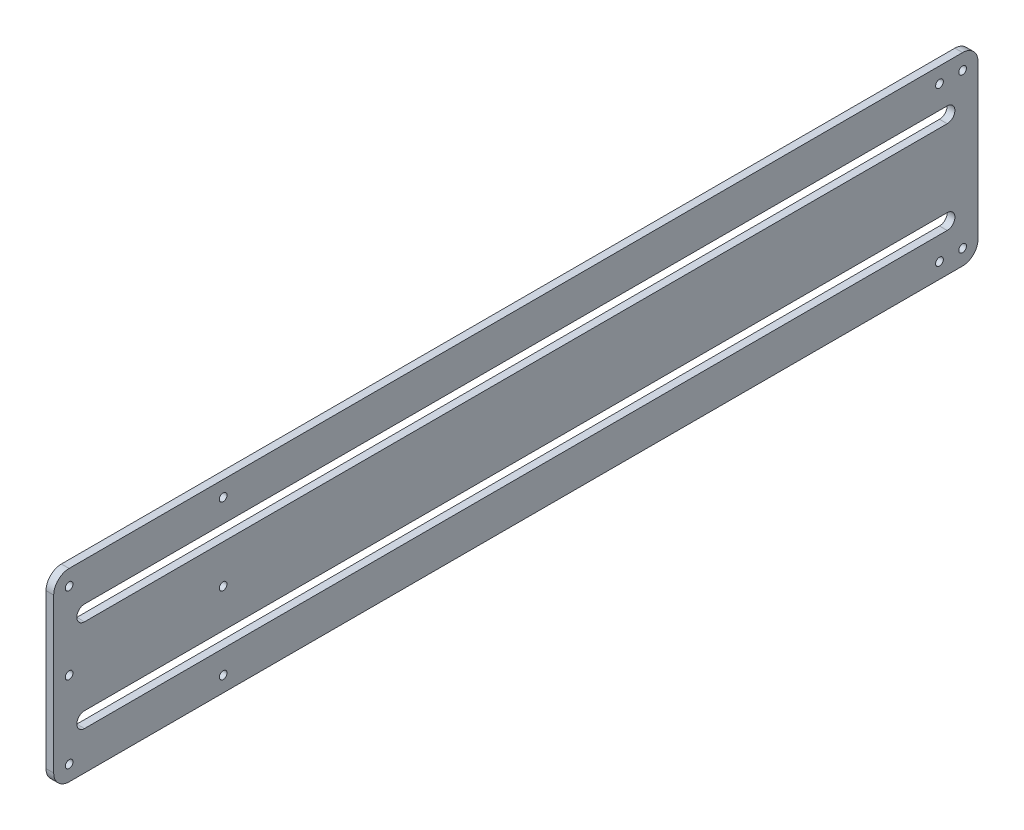
ISO-10303-21;
HEADER;
FILE_DESCRIPTION(('STEP AP214'),'2;1');
FILE_NAME('part.step','',(''),(''),'','','');
FILE_SCHEMA(('AUTOMOTIVE_DESIGN { 1 0 10303 214 1 1 1 1 }'));
ENDSEC;
DATA;
#1=APPLICATION_CONTEXT('core data for automotive mechanical design processes');
#2=APPLICATION_PROTOCOL_DEFINITION('international standard','automotive_design',2000,#1);
#3=PRODUCT_CONTEXT('',#1,'mechanical');
#4=PRODUCT('Part','Part','',(#3));
#5=PRODUCT_RELATED_PRODUCT_CATEGORY('part','',(#4));
#6=PRODUCT_DEFINITION_FORMATION('','',#4);
#7=PRODUCT_DEFINITION_CONTEXT('part definition',#1,'design');
#8=PRODUCT_DEFINITION('design','',#6,#7);
#9=PRODUCT_DEFINITION_SHAPE('','',#8);
#10=(LENGTH_UNIT() NAMED_UNIT(*) SI_UNIT(.MILLI.,.METRE.));
#11=(NAMED_UNIT(*) PLANE_ANGLE_UNIT() SI_UNIT($,.RADIAN.));
#12=(NAMED_UNIT(*) SI_UNIT($,.STERADIAN.) SOLID_ANGLE_UNIT());
#13=UNCERTAINTY_MEASURE_WITH_UNIT(LENGTH_MEASURE(1.E-05),#10,'distance_accuracy_value','');
#14=(GEOMETRIC_REPRESENTATION_CONTEXT(3) GLOBAL_UNCERTAINTY_ASSIGNED_CONTEXT((#13)) GLOBAL_UNIT_ASSIGNED_CONTEXT((#10,
#11,#12)) REPRESENTATION_CONTEXT('',''));
#15=CARTESIAN_POINT('',(0.,0.,0.));
#16=DIRECTION('',(0.,0.,1.));
#17=DIRECTION('',(1.,0.,0.));
#18=AXIS2_PLACEMENT_3D('',#15,#16,#17);
#19=CARTESIAN_POINT('',(1.5875,-31.75,184.15));
#20=DIRECTION('',(-1.,0.,0.));
#21=DIRECTION('',(0.,0.,1.));
#22=AXIS2_PLACEMENT_3D('',#19,#20,#21);
#23=CYLINDRICAL_SURFACE('',#22,6.35);
#24=CARTESIAN_POINT('',(-1.5875,-31.75,184.15));
#25=DIRECTION('',(1.,0.,0.));
#26=DIRECTION('',(0.,0.,-1.));
#27=AXIS2_PLACEMENT_3D('',#24,#25,#26);
#28=CIRCLE('',#27,6.35);
#29=CARTESIAN_POINT('',(-1.5875,-31.75,190.5));
#30=VERTEX_POINT('',#29);
#31=CARTESIAN_POINT('',(-1.5875,-38.1,184.15));
#32=VERTEX_POINT('',#31);
#33=EDGE_CURVE('E207',#30,#32,#28,.T.);
#34=ORIENTED_EDGE('',*,*,#33,.T.);
#35=DIRECTION('',(-1.,0.,0.));
#36=VECTOR('',#35,1.);
#37=CARTESIAN_POINT('',(1.5875,-38.1,184.15));
#38=LINE('',#37,#36);
#39=CARTESIAN_POINT('',(1.5875,-38.1,184.15));
#40=VERTEX_POINT('',#39);
#41=EDGE_CURVE('E11',#40,#32,#38,.T.);
#42=ORIENTED_EDGE('',*,*,#41,.F.);
#43=CARTESIAN_POINT('',(1.5875,-31.75,184.15));
#44=DIRECTION('',(1.,0.,0.));
#45=DIRECTION('',(0.,0.,-1.));
#46=AXIS2_PLACEMENT_3D('',#43,#44,#45);
#47=CIRCLE('',#46,6.35);
#48=CARTESIAN_POINT('',(1.5875,-31.75,190.5));
#49=VERTEX_POINT('',#48);
#50=EDGE_CURVE('E256',#49,#40,#47,.T.);
#51=ORIENTED_EDGE('',*,*,#50,.F.);
#52=DIRECTION('',(-1.,0.,0.));
#53=VECTOR('',#52,1.);
#54=CARTESIAN_POINT('',(1.5875,-31.75,190.5));
#55=LINE('',#54,#53);
#56=EDGE_CURVE('E282',#49,#30,#55,.T.);
#57=ORIENTED_EDGE('',*,*,#56,.T.);
#58=EDGE_LOOP('',(#34,#42,#51,#57));
#59=FACE_BOUND('',#58,.T.);
#60=ADVANCED_FACE('F45',(#59),#23,.T.);
#61=CARTESIAN_POINT('',(1.5875,-38.1,184.15));
#62=DIRECTION('',(0.,1.,0.));
#63=DIRECTION('',(0.,0.,1.));
#64=AXIS2_PLACEMENT_3D('',#61,#62,#63);
#65=PLANE('',#64);
#66=DIRECTION('',(0.,0.,-1.));
#67=VECTOR('',#66,1.);
#68=CARTESIAN_POINT('',(-1.5875,-38.1,184.15));
#69=LINE('',#68,#67);
#70=CARTESIAN_POINT('',(-1.5875,-38.1,-184.15));
#71=VERTEX_POINT('',#70);
#72=EDGE_CURVE('E286',#32,#71,#69,.T.);
#73=ORIENTED_EDGE('',*,*,#72,.T.);
#74=DIRECTION('',(-1.,0.,0.));
#75=VECTOR('',#74,1.);
#76=CARTESIAN_POINT('',(1.5875,-38.1,-184.15));
#77=LINE('',#76,#75);
#78=CARTESIAN_POINT('',(1.5875,-38.1,-184.15));
#79=VERTEX_POINT('',#78);
#80=EDGE_CURVE('E53',#79,#71,#77,.T.);
#81=ORIENTED_EDGE('',*,*,#80,.F.);
#82=DIRECTION('',(0.,0.,-1.));
#83=VECTOR('',#82,1.);
#84=CARTESIAN_POINT('',(1.5875,-38.1,184.15));
#85=LINE('',#84,#83);
#86=EDGE_CURVE('E260',#40,#79,#85,.T.);
#87=ORIENTED_EDGE('',*,*,#86,.F.);
#88=ORIENTED_EDGE('',*,*,#41,.T.);
#89=EDGE_LOOP('',(#73,#81,#87,#88));
#90=FACE_BOUND('',#89,.T.);
#91=ADVANCED_FACE('F356',(#90),#65,.F.);
#92=CARTESIAN_POINT('',(1.5875,-31.75,-184.15));
#93=DIRECTION('',(-1.,0.,0.));
#94=DIRECTION('',(0.,0.,1.));
#95=AXIS2_PLACEMENT_3D('',#92,#93,#94);
#96=CYLINDRICAL_SURFACE('',#95,6.35);
#97=CARTESIAN_POINT('',(-1.5875,-31.75,-184.15));
#98=DIRECTION('',(1.,0.,0.));
#99=DIRECTION('',(0.,0.,-1.));
#100=AXIS2_PLACEMENT_3D('',#97,#98,#99);
#101=CIRCLE('',#100,6.35);
#102=CARTESIAN_POINT('',(-1.5875,-31.75,-190.5));
#103=VERTEX_POINT('',#102);
#104=EDGE_CURVE('E289',#71,#103,#101,.T.);
#105=ORIENTED_EDGE('',*,*,#104,.T.);
#106=DIRECTION('',(-1.,0.,0.));
#107=VECTOR('',#106,1.);
#108=CARTESIAN_POINT('',(1.5875,-31.75,-190.5));
#109=LINE('',#108,#107);
#110=CARTESIAN_POINT('',(1.5875,-31.75,-190.5));
#111=VERTEX_POINT('',#110);
#112=EDGE_CURVE('E325',#111,#103,#109,.T.);
#113=ORIENTED_EDGE('',*,*,#112,.F.);
#114=CARTESIAN_POINT('',(1.5875,-31.75,-184.15));
#115=DIRECTION('',(1.,0.,0.));
#116=DIRECTION('',(0.,0.,-1.));
#117=AXIS2_PLACEMENT_3D('',#114,#115,#116);
#118=CIRCLE('',#117,6.35);
#119=EDGE_CURVE('E264',#79,#111,#118,.T.);
#120=ORIENTED_EDGE('',*,*,#119,.F.);
#121=ORIENTED_EDGE('',*,*,#80,.T.);
#122=EDGE_LOOP('',(#105,#113,#120,#121));
#123=FACE_BOUND('',#122,.T.);
#124=ADVANCED_FACE('F334',(#123),#96,.T.);
#125=CARTESIAN_POINT('',(1.5875,-31.75,-190.5));
#126=DIRECTION('',(0.,0.,1.));
#127=DIRECTION('',(1.,0.,0.));
#128=AXIS2_PLACEMENT_3D('',#125,#126,#127);
#129=PLANE('',#128);
#130=DIRECTION('',(0.,1.,0.));
#131=VECTOR('',#130,1.);
#132=CARTESIAN_POINT('',(-1.5875,-31.75,-190.5));
#133=LINE('',#132,#131);
#134=CARTESIAN_POINT('',(-1.5875,31.75,-190.5));
#135=VERTEX_POINT('',#134);
#136=EDGE_CURVE('E292',#103,#135,#133,.T.);
#137=ORIENTED_EDGE('',*,*,#136,.T.);
#138=DIRECTION('',(-1.,0.,0.));
#139=VECTOR('',#138,1.);
#140=CARTESIAN_POINT('',(1.5875,31.75,-190.5));
#141=LINE('',#140,#139);
#142=CARTESIAN_POINT('',(1.5875,31.75,-190.5));
#143=VERTEX_POINT('',#142);
#144=EDGE_CURVE('E321',#143,#135,#141,.T.);
#145=ORIENTED_EDGE('',*,*,#144,.F.);
#146=DIRECTION('',(0.,1.,0.));
#147=VECTOR('',#146,1.);
#148=CARTESIAN_POINT('',(1.5875,-31.75,-190.5));
#149=LINE('',#148,#147);
#150=EDGE_CURVE('E267',#111,#143,#149,.T.);
#151=ORIENTED_EDGE('',*,*,#150,.F.);
#152=ORIENTED_EDGE('',*,*,#112,.T.);
#153=EDGE_LOOP('',(#137,#145,#151,#152));
#154=FACE_BOUND('',#153,.T.);
#155=ADVANCED_FACE('F344',(#154),#129,.F.);
#156=CARTESIAN_POINT('',(1.5875,31.75,-184.15));
#157=DIRECTION('',(-1.,0.,0.));
#158=DIRECTION('',(0.,0.,1.));
#159=AXIS2_PLACEMENT_3D('',#156,#157,#158);
#160=CYLINDRICAL_SURFACE('',#159,6.35);
#161=CARTESIAN_POINT('',(-1.5875,31.75,-184.15));
#162=DIRECTION('',(1.,0.,0.));
#163=DIRECTION('',(0.,0.,-1.));
#164=AXIS2_PLACEMENT_3D('',#161,#162,#163);
#165=CIRCLE('',#164,6.35);
#166=CARTESIAN_POINT('',(-1.5875,38.1,-184.15));
#167=VERTEX_POINT('',#166);
#168=EDGE_CURVE('E295',#135,#167,#165,.T.);
#169=ORIENTED_EDGE('',*,*,#168,.T.);
#170=DIRECTION('',(-1.,0.,0.));
#171=VECTOR('',#170,1.);
#172=CARTESIAN_POINT('',(1.5875,38.1,-184.15));
#173=LINE('',#172,#171);
#174=CARTESIAN_POINT('',(1.5875,38.1,-184.15));
#175=VERTEX_POINT('',#174);
#176=EDGE_CURVE('E317',#175,#167,#173,.T.);
#177=ORIENTED_EDGE('',*,*,#176,.F.);
#178=CARTESIAN_POINT('',(1.5875,31.75,-184.15));
#179=DIRECTION('',(1.,0.,0.));
#180=DIRECTION('',(0.,0.,-1.));
#181=AXIS2_PLACEMENT_3D('',#178,#179,#180);
#182=CIRCLE('',#181,6.35);
#183=EDGE_CURVE('E270',#143,#175,#182,.T.);
#184=ORIENTED_EDGE('',*,*,#183,.F.);
#185=ORIENTED_EDGE('',*,*,#144,.T.);
#186=EDGE_LOOP('',(#169,#177,#184,#185));
#187=FACE_BOUND('',#186,.T.);
#188=ADVANCED_FACE('F348',(#187),#160,.T.);
#189=CARTESIAN_POINT('',(1.5875,38.1,184.15));
#190=DIRECTION('',(0.,-1.,0.));
#191=DIRECTION('',(0.,0.,-1.));
#192=AXIS2_PLACEMENT_3D('',#189,#190,#191);
#193=PLANE('',#192);
#194=DIRECTION('',(0.,0.,1.));
#195=VECTOR('',#194,1.);
#196=CARTESIAN_POINT('',(-1.5875,38.1,184.15));
#197=LINE('',#196,#195);
#198=CARTESIAN_POINT('',(-1.5875,38.1,184.15));
#199=VERTEX_POINT('',#198);
#200=EDGE_CURVE('E298',#167,#199,#197,.T.);
#201=ORIENTED_EDGE('',*,*,#200,.T.);
#202=DIRECTION('',(-1.,0.,0.));
#203=VECTOR('',#202,1.);
#204=CARTESIAN_POINT('',(1.5875,38.1,184.15));
#205=LINE('',#204,#203);
#206=CARTESIAN_POINT('',(1.5875,38.1,184.15));
#207=VERTEX_POINT('',#206);
#208=EDGE_CURVE('E313',#207,#199,#205,.T.);
#209=ORIENTED_EDGE('',*,*,#208,.F.);
#210=DIRECTION('',(0.,0.,1.));
#211=VECTOR('',#210,1.);
#212=CARTESIAN_POINT('',(1.5875,38.1,184.15));
#213=LINE('',#212,#211);
#214=EDGE_CURVE('E273',#175,#207,#213,.T.);
#215=ORIENTED_EDGE('',*,*,#214,.F.);
#216=ORIENTED_EDGE('',*,*,#176,.T.);
#217=EDGE_LOOP('',(#201,#209,#215,#216));
#218=FACE_BOUND('',#217,.T.);
#219=ADVANCED_FACE('F369',(#218),#193,.F.);
#220=CARTESIAN_POINT('',(1.5875,31.75,184.15));
#221=DIRECTION('',(-1.,0.,0.));
#222=DIRECTION('',(0.,0.,1.));
#223=AXIS2_PLACEMENT_3D('',#220,#221,#222);
#224=CYLINDRICAL_SURFACE('',#223,6.35);
#225=CARTESIAN_POINT('',(-1.5875,31.75,184.15));
#226=DIRECTION('',(1.,0.,0.));
#227=DIRECTION('',(0.,0.,-1.));
#228=AXIS2_PLACEMENT_3D('',#225,#226,#227);
#229=CIRCLE('',#228,6.35);
#230=CARTESIAN_POINT('',(-1.5875,31.75,190.5));
#231=VERTEX_POINT('',#230);
#232=EDGE_CURVE('E301',#199,#231,#229,.T.);
#233=ORIENTED_EDGE('',*,*,#232,.T.);
#234=DIRECTION('',(-1.,0.,0.));
#235=VECTOR('',#234,1.);
#236=CARTESIAN_POINT('',(1.5875,31.75,190.5));
#237=LINE('',#236,#235);
#238=CARTESIAN_POINT('',(1.5875,31.75,190.5));
#239=VERTEX_POINT('',#238);
#240=EDGE_CURVE('E309',#239,#231,#237,.T.);
#241=ORIENTED_EDGE('',*,*,#240,.F.);
#242=CARTESIAN_POINT('',(1.5875,31.75,184.15));
#243=DIRECTION('',(1.,0.,0.));
#244=DIRECTION('',(0.,0.,-1.));
#245=AXIS2_PLACEMENT_3D('',#242,#243,#244);
#246=CIRCLE('',#245,6.35);
#247=EDGE_CURVE('E276',#207,#239,#246,.T.);
#248=ORIENTED_EDGE('',*,*,#247,.F.);
#249=ORIENTED_EDGE('',*,*,#208,.T.);
#250=EDGE_LOOP('',(#233,#241,#248,#249));
#251=FACE_BOUND('',#250,.T.);
#252=ADVANCED_FACE('F367',(#251),#224,.T.);
#253=CARTESIAN_POINT('',(1.5875,-31.75,190.5));
#254=DIRECTION('',(0.,0.,-1.));
#255=DIRECTION('',(-1.,0.,0.));
#256=AXIS2_PLACEMENT_3D('',#253,#254,#255);
#257=PLANE('',#256);
#258=DIRECTION('',(0.,-1.,0.));
#259=VECTOR('',#258,1.);
#260=CARTESIAN_POINT('',(-1.5875,-31.75,190.5));
#261=LINE('',#260,#259);
#262=EDGE_CURVE('E261',#231,#30,#261,.T.);
#263=ORIENTED_EDGE('',*,*,#262,.T.);
#264=ORIENTED_EDGE('',*,*,#56,.F.);
#265=DIRECTION('',(0.,-1.,0.));
#266=VECTOR('',#265,1.);
#267=CARTESIAN_POINT('',(1.5875,-31.75,190.5));
#268=LINE('',#267,#266);
#269=EDGE_CURVE('E279',#239,#49,#268,.T.);
#270=ORIENTED_EDGE('',*,*,#269,.F.);
#271=ORIENTED_EDGE('',*,*,#240,.T.);
#272=EDGE_LOOP('',(#263,#264,#270,#271));
#273=FACE_BOUND('',#272,.T.);
#274=ADVANCED_FACE('F362',(#273),#257,.F.);
#275=CARTESIAN_POINT('',(1.5875,-31.75,184.15));
#276=DIRECTION('',(1.,0.,0.));
#277=DIRECTION('',(0.,0.,-1.));
#278=AXIS2_PLACEMENT_3D('',#275,#276,#277);
#279=PLANE('',#278);
#280=CARTESIAN_POINT('',(1.5875,-31.75,-184.15));
#281=DIRECTION('',(1.,0.,0.));
#282=DIRECTION('',(0.,0.,1.));
#283=AXIS2_PLACEMENT_3D('',#280,#281,#282);
#284=CIRCLE('',#283,1.58749999999999);
#285=CARTESIAN_POINT('',(1.5875,-31.75,-182.5625));
#286=VERTEX_POINT('',#285);
#287=EDGE_CURVE('E618',#286,#286,#284,.T.);
#288=ORIENTED_EDGE('',*,*,#287,.F.);
#289=EDGE_LOOP('',(#288));
#290=FACE_BOUND('',#289,.T.);
#291=CARTESIAN_POINT('',(1.5875,-31.7499999999999,-174.625));
#292=DIRECTION('',(1.,0.,0.));
#293=DIRECTION('',(0.,0.,1.));
#294=AXIS2_PLACEMENT_3D('',#291,#292,#293);
#295=CIRCLE('',#294,1.58749999999999);
#296=CARTESIAN_POINT('',(1.5875,-31.7499999999999,-173.0375));
#297=VERTEX_POINT('',#296);
#298=EDGE_CURVE('E625',#297,#297,#295,.T.);
#299=ORIENTED_EDGE('',*,*,#298,.F.);
#300=EDGE_LOOP('',(#299));
#301=FACE_BOUND('',#300,.T.);
#302=CARTESIAN_POINT('',(1.5875,31.7499999999999,-174.625));
#303=DIRECTION('',(1.,0.,0.));
#304=DIRECTION('',(0.,0.,-1.));
#305=AXIS2_PLACEMENT_3D('',#302,#303,#304);
#306=CIRCLE('',#305,1.58749999999999);
#307=CARTESIAN_POINT('',(1.5875,31.7499999999999,-176.2125));
#308=VERTEX_POINT('',#307);
#309=EDGE_CURVE('E639',#308,#308,#306,.T.);
#310=ORIENTED_EDGE('',*,*,#309,.F.);
#311=EDGE_LOOP('',(#310));
#312=FACE_BOUND('',#311,.T.);
#313=CARTESIAN_POINT('',(1.5875,31.75,-184.15));
#314=DIRECTION('',(1.,0.,0.));
#315=DIRECTION('',(0.,0.,-1.));
#316=AXIS2_PLACEMENT_3D('',#313,#314,#315);
#317=CIRCLE('',#316,1.58749999999999);
#318=CARTESIAN_POINT('',(1.5875,31.75,-185.7375));
#319=VERTEX_POINT('',#318);
#320=EDGE_CURVE('E635',#319,#319,#317,.T.);
#321=ORIENTED_EDGE('',*,*,#320,.F.);
#322=EDGE_LOOP('',(#321));
#323=FACE_BOUND('',#322,.T.);
#324=CARTESIAN_POINT('',(1.5875,31.75,120.65));
#325=DIRECTION('',(1.,0.,0.));
#326=DIRECTION('',(0.,0.,-1.));
#327=AXIS2_PLACEMENT_3D('',#324,#325,#326);
#328=CIRCLE('',#327,1.58749999999999);
#329=CARTESIAN_POINT('',(1.5875,31.75,119.0625));
#330=VERTEX_POINT('',#329);
#331=EDGE_CURVE('E648',#330,#330,#328,.T.);
#332=ORIENTED_EDGE('',*,*,#331,.F.);
#333=EDGE_LOOP('',(#332));
#334=FACE_BOUND('',#333,.T.);
#335=CARTESIAN_POINT('',(1.5875,0.,120.65));
#336=DIRECTION('',(1.,0.,0.));
#337=DIRECTION('',(0.,0.,-1.));
#338=AXIS2_PLACEMENT_3D('',#335,#336,#337);
#339=CIRCLE('',#338,1.5875);
#340=CARTESIAN_POINT('',(1.5875,0.,119.0625));
#341=VERTEX_POINT('',#340);
#342=EDGE_CURVE('E656',#341,#341,#339,.T.);
#343=ORIENTED_EDGE('',*,*,#342,.F.);
#344=EDGE_LOOP('',(#343));
#345=FACE_BOUND('',#344,.T.);
#346=CARTESIAN_POINT('',(1.5875,-31.75,120.65));
#347=DIRECTION('',(1.,0.,0.));
#348=DIRECTION('',(0.,0.,1.));
#349=AXIS2_PLACEMENT_3D('',#346,#347,#348);
#350=CIRCLE('',#349,1.58749999999999);
#351=CARTESIAN_POINT('',(1.5875,-31.75,122.2375));
#352=VERTEX_POINT('',#351);
#353=EDGE_CURVE('E664',#352,#352,#350,.T.);
#354=ORIENTED_EDGE('',*,*,#353,.F.);
#355=EDGE_LOOP('',(#354));
#356=FACE_BOUND('',#355,.T.);
#357=CARTESIAN_POINT('',(1.5875,-31.75,184.15));
#358=DIRECTION('',(1.,0.,0.));
#359=DIRECTION('',(0.,0.,1.));
#360=AXIS2_PLACEMENT_3D('',#357,#358,#359);
#361=CIRCLE('',#360,1.58749999999999);
#362=CARTESIAN_POINT('',(1.5875,-31.75,185.7375));
#363=VERTEX_POINT('',#362);
#364=EDGE_CURVE('E672',#363,#363,#361,.T.);
#365=ORIENTED_EDGE('',*,*,#364,.F.);
#366=EDGE_LOOP('',(#365));
#367=FACE_BOUND('',#366,.T.);
#368=CARTESIAN_POINT('',(1.5875,0.,184.15));
#369=DIRECTION('',(1.,0.,0.));
#370=DIRECTION('',(0.,0.,-1.));
#371=AXIS2_PLACEMENT_3D('',#368,#369,#370);
#372=CIRCLE('',#371,1.58749999999999);
#373=CARTESIAN_POINT('',(1.5875,0.,182.5625));
#374=VERTEX_POINT('',#373);
#375=EDGE_CURVE('E640',#374,#374,#372,.T.);
#376=ORIENTED_EDGE('',*,*,#375,.F.);
#377=EDGE_LOOP('',(#376));
#378=FACE_BOUND('',#377,.T.);
#379=CARTESIAN_POINT('',(1.5875,31.75,184.15));
#380=DIRECTION('',(1.,0.,0.));
#381=DIRECTION('',(0.,0.,-1.));
#382=AXIS2_PLACEMENT_3D('',#379,#380,#381);
#383=CIRCLE('',#382,1.58749999999999);
#384=CARTESIAN_POINT('',(1.5875,31.75,182.5625));
#385=VERTEX_POINT('',#384);
#386=EDGE_CURVE('E189',#385,#385,#383,.T.);
#387=ORIENTED_EDGE('',*,*,#386,.F.);
#388=EDGE_LOOP('',(#387));
#389=FACE_BOUND('',#388,.T.);
#390=CARTESIAN_POINT('',(1.5875,19.05,177.8));
#391=DIRECTION('',(1.,0.,0.));
#392=DIRECTION('',(0.,0.,-1.));
#393=AXIS2_PLACEMENT_3D('',#390,#391,#392);
#394=CIRCLE('',#393,3.175);
#395=CARTESIAN_POINT('',(1.5875,22.225,177.8));
#396=VERTEX_POINT('',#395);
#397=CARTESIAN_POINT('',(1.5875,15.875,177.8));
#398=VERTEX_POINT('',#397);
#399=EDGE_CURVE('E60',#396,#398,#394,.T.);
#400=ORIENTED_EDGE('',*,*,#399,.F.);
#401=DIRECTION('',(0.,0.,1.));
#402=VECTOR('',#401,1.);
#403=CARTESIAN_POINT('',(1.5875,22.225,177.8));
#404=LINE('',#403,#402);
#405=CARTESIAN_POINT('',(1.5875,22.225,-177.8));
#406=VERTEX_POINT('',#405);
#407=EDGE_CURVE('E182',#406,#396,#404,.T.);
#408=ORIENTED_EDGE('',*,*,#407,.F.);
#409=CARTESIAN_POINT('',(1.5875,19.05,-177.8));
#410=DIRECTION('',(1.,0.,0.));
#411=DIRECTION('',(0.,0.,-1.));
#412=AXIS2_PLACEMENT_3D('',#409,#410,#411);
#413=CIRCLE('',#412,3.175);
#414=CARTESIAN_POINT('',(1.5875,15.875,-177.8));
#415=VERTEX_POINT('',#414);
#416=EDGE_CURVE('E186',#415,#406,#413,.T.);
#417=ORIENTED_EDGE('',*,*,#416,.F.);
#418=DIRECTION('',(0.,0.,-1.));
#419=VECTOR('',#418,1.);
#420=CARTESIAN_POINT('',(1.5875,15.875,177.8));
#421=LINE('',#420,#419);
#422=EDGE_CURVE('E198',#398,#415,#421,.T.);
#423=ORIENTED_EDGE('',*,*,#422,.F.);
#424=EDGE_LOOP('',(#400,#408,#417,#423));
#425=FACE_BOUND('',#424,.T.);
#426=CARTESIAN_POINT('',(1.5875,-19.05,177.8));
#427=DIRECTION('',(1.,0.,0.));
#428=DIRECTION('',(0.,0.,1.));
#429=AXIS2_PLACEMENT_3D('',#426,#427,#428);
#430=CIRCLE('',#429,3.175);
#431=CARTESIAN_POINT('',(1.5875,-15.875,177.8));
#432=VERTEX_POINT('',#431);
#433=CARTESIAN_POINT('',(1.5875,-22.225,177.8));
#434=VERTEX_POINT('',#433);
#435=EDGE_CURVE('E68',#432,#434,#430,.T.);
#436=ORIENTED_EDGE('',*,*,#435,.F.);
#437=DIRECTION('',(0.,0.,1.));
#438=VECTOR('',#437,1.);
#439=CARTESIAN_POINT('',(1.5875,-15.875,177.8));
#440=LINE('',#439,#438);
#441=CARTESIAN_POINT('',(1.5875,-15.875,-177.8));
#442=VERTEX_POINT('',#441);
#443=EDGE_CURVE('E227',#442,#432,#440,.T.);
#444=ORIENTED_EDGE('',*,*,#443,.F.);
#445=CARTESIAN_POINT('',(1.5875,-19.05,-177.8));
#446=DIRECTION('',(1.,0.,0.));
#447=DIRECTION('',(0.,0.,1.));
#448=AXIS2_PLACEMENT_3D('',#445,#446,#447);
#449=CIRCLE('',#448,3.175);
#450=CARTESIAN_POINT('',(1.5875,-22.225,-177.8));
#451=VERTEX_POINT('',#450);
#452=EDGE_CURVE('E231',#451,#442,#449,.T.);
#453=ORIENTED_EDGE('',*,*,#452,.F.);
#454=DIRECTION('',(0.,0.,-1.));
#455=VECTOR('',#454,1.);
#456=CARTESIAN_POINT('',(1.5875,-22.225,177.8));
#457=LINE('',#456,#455);
#458=EDGE_CURVE('E236',#434,#451,#457,.T.);
#459=ORIENTED_EDGE('',*,*,#458,.F.);
#460=EDGE_LOOP('',(#436,#444,#453,#459));
#461=FACE_BOUND('',#460,.T.);
#462=ORIENTED_EDGE('',*,*,#50,.T.);
#463=ORIENTED_EDGE('',*,*,#86,.T.);
#464=ORIENTED_EDGE('',*,*,#119,.T.);
#465=ORIENTED_EDGE('',*,*,#150,.T.);
#466=ORIENTED_EDGE('',*,*,#183,.T.);
#467=ORIENTED_EDGE('',*,*,#214,.T.);
#468=ORIENTED_EDGE('',*,*,#247,.T.);
#469=ORIENTED_EDGE('',*,*,#269,.T.);
#470=EDGE_LOOP('',(#462,#463,#464,#465,#466,#467,#468,#469));
#471=FACE_BOUND('',#470,.T.);
#472=ADVANCED_FACE('F352',(#290,#301,#312,#323,#334,#345,#356,#367,#378,#389,#425,#461,#471),
#279,.T.);
#473=CARTESIAN_POINT('',(-1.5875,-31.75,184.15));
#474=DIRECTION('',(1.,0.,0.));
#475=DIRECTION('',(0.,0.,-1.));
#476=AXIS2_PLACEMENT_3D('',#473,#474,#475);
#477=PLANE('',#476);
#478=CARTESIAN_POINT('',(-1.5875,-31.75,-184.15));
#479=DIRECTION('',(1.,0.,0.));
#480=DIRECTION('',(0.,0.,1.));
#481=AXIS2_PLACEMENT_3D('',#478,#479,#480);
#482=CIRCLE('',#481,1.58749999999999);
#483=CARTESIAN_POINT('',(-1.5875,-31.75,-182.5625));
#484=VERTEX_POINT('',#483);
#485=EDGE_CURVE('E615',#484,#484,#482,.T.);
#486=ORIENTED_EDGE('',*,*,#485,.T.);
#487=EDGE_LOOP('',(#486));
#488=FACE_BOUND('',#487,.T.);
#489=CARTESIAN_POINT('',(-1.5875,-31.7499999999999,-174.625));
#490=DIRECTION('',(1.,0.,0.));
#491=DIRECTION('',(0.,0.,1.));
#492=AXIS2_PLACEMENT_3D('',#489,#490,#491);
#493=CIRCLE('',#492,1.58749999999999);
#494=CARTESIAN_POINT('',(-1.5875,-31.7499999999999,-173.0375));
#495=VERTEX_POINT('',#494);
#496=EDGE_CURVE('E620',#495,#495,#493,.T.);
#497=ORIENTED_EDGE('',*,*,#496,.T.);
#498=EDGE_LOOP('',(#497));
#499=FACE_BOUND('',#498,.T.);
#500=CARTESIAN_POINT('',(-1.5875,31.7499999999999,-174.625));
#501=DIRECTION('',(1.,0.,0.));
#502=DIRECTION('',(0.,0.,-1.));
#503=AXIS2_PLACEMENT_3D('',#500,#501,#502);
#504=CIRCLE('',#503,1.58749999999999);
#505=CARTESIAN_POINT('',(-1.5875,31.7499999999999,-176.2125));
#506=VERTEX_POINT('',#505);
#507=EDGE_CURVE('E701',#506,#506,#504,.T.);
#508=ORIENTED_EDGE('',*,*,#507,.T.);
#509=EDGE_LOOP('',(#508));
#510=FACE_BOUND('',#509,.T.);
#511=CARTESIAN_POINT('',(-1.5875,31.75,-184.15));
#512=DIRECTION('',(1.,0.,0.));
#513=DIRECTION('',(0.,0.,-1.));
#514=AXIS2_PLACEMENT_3D('',#511,#512,#513);
#515=CIRCLE('',#514,1.58749999999999);
#516=CARTESIAN_POINT('',(-1.5875,31.75,-185.7375));
#517=VERTEX_POINT('',#516);
#518=EDGE_CURVE('E630',#517,#517,#515,.T.);
#519=ORIENTED_EDGE('',*,*,#518,.T.);
#520=EDGE_LOOP('',(#519));
#521=FACE_BOUND('',#520,.T.);
#522=CARTESIAN_POINT('',(-1.5875,31.75,120.65));
#523=DIRECTION('',(1.,0.,0.));
#524=DIRECTION('',(0.,0.,-1.));
#525=AXIS2_PLACEMENT_3D('',#522,#523,#524);
#526=CIRCLE('',#525,1.58749999999999);
#527=CARTESIAN_POINT('',(-1.5875,31.75,119.0625));
#528=VERTEX_POINT('',#527);
#529=EDGE_CURVE('E652',#528,#528,#526,.T.);
#530=ORIENTED_EDGE('',*,*,#529,.T.);
#531=EDGE_LOOP('',(#530));
#532=FACE_BOUND('',#531,.T.);
#533=CARTESIAN_POINT('',(-1.5875,0.,120.65));
#534=DIRECTION('',(1.,0.,0.));
#535=DIRECTION('',(0.,0.,-1.));
#536=AXIS2_PLACEMENT_3D('',#533,#534,#535);
#537=CIRCLE('',#536,1.5875);
#538=CARTESIAN_POINT('',(-1.5875,0.,119.0625));
#539=VERTEX_POINT('',#538);
#540=EDGE_CURVE('E660',#539,#539,#537,.T.);
#541=ORIENTED_EDGE('',*,*,#540,.T.);
#542=EDGE_LOOP('',(#541));
#543=FACE_BOUND('',#542,.T.);
#544=CARTESIAN_POINT('',(-1.5875,-31.75,120.65));
#545=DIRECTION('',(1.,0.,0.));
#546=DIRECTION('',(0.,0.,1.));
#547=AXIS2_PLACEMENT_3D('',#544,#545,#546);
#548=CIRCLE('',#547,1.58749999999999);
#549=CARTESIAN_POINT('',(-1.5875,-31.75,122.2375));
#550=VERTEX_POINT('',#549);
#551=EDGE_CURVE('E668',#550,#550,#548,.T.);
#552=ORIENTED_EDGE('',*,*,#551,.T.);
#553=EDGE_LOOP('',(#552));
#554=FACE_BOUND('',#553,.T.);
#555=CARTESIAN_POINT('',(-1.5875,-31.75,184.15));
#556=DIRECTION('',(1.,0.,0.));
#557=DIRECTION('',(0.,0.,1.));
#558=AXIS2_PLACEMENT_3D('',#555,#556,#557);
#559=CIRCLE('',#558,1.58749999999999);
#560=CARTESIAN_POINT('',(-1.5875,-31.75,185.7375));
#561=VERTEX_POINT('',#560);
#562=EDGE_CURVE('E644',#561,#561,#559,.T.);
#563=ORIENTED_EDGE('',*,*,#562,.T.);
#564=EDGE_LOOP('',(#563));
#565=FACE_BOUND('',#564,.T.);
#566=CARTESIAN_POINT('',(-1.5875,0.,184.15));
#567=DIRECTION('',(1.,0.,0.));
#568=DIRECTION('',(0.,0.,-1.));
#569=AXIS2_PLACEMENT_3D('',#566,#567,#568);
#570=CIRCLE('',#569,1.58749999999999);
#571=CARTESIAN_POINT('',(-1.5875,0.,182.5625));
#572=VERTEX_POINT('',#571);
#573=EDGE_CURVE('E634',#572,#572,#570,.T.);
#574=ORIENTED_EDGE('',*,*,#573,.T.);
#575=EDGE_LOOP('',(#574));
#576=FACE_BOUND('',#575,.T.);
#577=CARTESIAN_POINT('',(-1.5875,31.75,184.15));
#578=DIRECTION('',(1.,0.,0.));
#579=DIRECTION('',(0.,0.,-1.));
#580=AXIS2_PLACEMENT_3D('',#577,#578,#579);
#581=CIRCLE('',#580,1.58749999999999);
#582=CARTESIAN_POINT('',(-1.5875,31.75,182.5625));
#583=VERTEX_POINT('',#582);
#584=EDGE_CURVE('E226',#583,#583,#581,.T.);
#585=ORIENTED_EDGE('',*,*,#584,.T.);
#586=EDGE_LOOP('',(#585));
#587=FACE_BOUND('',#586,.T.);
#588=DIRECTION('',(0.,0.,1.));
#589=VECTOR('',#588,1.);
#590=CARTESIAN_POINT('',(-1.5875,22.225,177.8));
#591=LINE('',#590,#589);
#592=CARTESIAN_POINT('',(-1.5875,22.225,-177.8));
#593=VERTEX_POINT('',#592);
#594=CARTESIAN_POINT('',(-1.5875,22.225,177.8));
#595=VERTEX_POINT('',#594);
#596=EDGE_CURVE('E167',#593,#595,#591,.T.);
#597=ORIENTED_EDGE('',*,*,#596,.T.);
#598=CARTESIAN_POINT('',(-1.5875,19.05,177.8));
#599=DIRECTION('',(1.,0.,0.));
#600=DIRECTION('',(0.,0.,-1.));
#601=AXIS2_PLACEMENT_3D('',#598,#599,#600);
#602=CIRCLE('',#601,3.175);
#603=CARTESIAN_POINT('',(-1.5875,15.875,177.8));
#604=VERTEX_POINT('',#603);
#605=EDGE_CURVE('E160',#595,#604,#602,.T.);
#606=ORIENTED_EDGE('',*,*,#605,.T.);
#607=DIRECTION('',(0.,0.,-1.));
#608=VECTOR('',#607,1.);
#609=CARTESIAN_POINT('',(-1.5875,15.875,177.8));
#610=LINE('',#609,#608);
#611=CARTESIAN_POINT('',(-1.5875,15.875,-177.8));
#612=VERTEX_POINT('',#611);
#613=EDGE_CURVE('E171',#604,#612,#610,.T.);
#614=ORIENTED_EDGE('',*,*,#613,.T.);
#615=CARTESIAN_POINT('',(-1.5875,19.05,-177.8));
#616=DIRECTION('',(1.,0.,0.));
#617=DIRECTION('',(0.,0.,-1.));
#618=AXIS2_PLACEMENT_3D('',#615,#616,#617);
#619=CIRCLE('',#618,3.175);
#620=EDGE_CURVE('E176',#612,#593,#619,.T.);
#621=ORIENTED_EDGE('',*,*,#620,.T.);
#622=EDGE_LOOP('',(#597,#606,#614,#621));
#623=FACE_BOUND('',#622,.T.);
#624=DIRECTION('',(0.,0.,1.));
#625=VECTOR('',#624,1.);
#626=CARTESIAN_POINT('',(-1.5875,-15.875,177.8));
#627=LINE('',#626,#625);
#628=CARTESIAN_POINT('',(-1.5875,-15.875,-177.8));
#629=VERTEX_POINT('',#628);
#630=CARTESIAN_POINT('',(-1.5875,-15.875,177.8));
#631=VERTEX_POINT('',#630);
#632=EDGE_CURVE('E216',#629,#631,#627,.T.);
#633=ORIENTED_EDGE('',*,*,#632,.T.);
#634=CARTESIAN_POINT('',(-1.5875,-19.05,177.8));
#635=DIRECTION('',(1.,0.,0.));
#636=DIRECTION('',(0.,0.,1.));
#637=AXIS2_PLACEMENT_3D('',#634,#635,#636);
#638=CIRCLE('',#637,3.175);
#639=CARTESIAN_POINT('',(-1.5875,-22.225,177.8));
#640=VERTEX_POINT('',#639);
#641=EDGE_CURVE('E232',#631,#640,#638,.T.);
#642=ORIENTED_EDGE('',*,*,#641,.T.);
#643=DIRECTION('',(0.,0.,-1.));
#644=VECTOR('',#643,1.);
#645=CARTESIAN_POINT('',(-1.5875,-22.225,177.8));
#646=LINE('',#645,#644);
#647=CARTESIAN_POINT('',(-1.5875,-22.225,-177.8));
#648=VERTEX_POINT('',#647);
#649=EDGE_CURVE('E249',#640,#648,#646,.T.);
#650=ORIENTED_EDGE('',*,*,#649,.T.);
#651=CARTESIAN_POINT('',(-1.5875,-19.05,-177.8));
#652=DIRECTION('',(1.,0.,0.));
#653=DIRECTION('',(0.,0.,1.));
#654=AXIS2_PLACEMENT_3D('',#651,#652,#653);
#655=CIRCLE('',#654,3.175);
#656=EDGE_CURVE('E245',#648,#629,#655,.T.);
#657=ORIENTED_EDGE('',*,*,#656,.T.);
#658=EDGE_LOOP('',(#633,#642,#650,#657));
#659=FACE_BOUND('',#658,.T.);
#660=ORIENTED_EDGE('',*,*,#33,.F.);
#661=ORIENTED_EDGE('',*,*,#262,.F.);
#662=ORIENTED_EDGE('',*,*,#232,.F.);
#663=ORIENTED_EDGE('',*,*,#200,.F.);
#664=ORIENTED_EDGE('',*,*,#168,.F.);
#665=ORIENTED_EDGE('',*,*,#136,.F.);
#666=ORIENTED_EDGE('',*,*,#104,.F.);
#667=ORIENTED_EDGE('',*,*,#72,.F.);
#668=EDGE_LOOP('',(#660,#661,#662,#663,#664,#665,#666,#667));
#669=FACE_BOUND('',#668,.T.);
#670=ADVANCED_FACE('F178',(#488,#499,#510,#521,#532,#543,#554,#565,#576,#587,#623,#659,#669),
#477,.F.);
#671=CARTESIAN_POINT('',(-1.5875,-19.05,177.8));
#672=DIRECTION('',(1.,0.,0.));
#673=DIRECTION('',(0.,0.,-1.));
#674=AXIS2_PLACEMENT_3D('',#671,#672,#673);
#675=CYLINDRICAL_SURFACE('',#674,3.175);
#676=ORIENTED_EDGE('',*,*,#435,.T.);
#677=DIRECTION('',(1.,0.,0.));
#678=VECTOR('',#677,1.);
#679=CARTESIAN_POINT('',(-1.5875,-22.225,177.8));
#680=LINE('',#679,#678);
#681=EDGE_CURVE('E213',#640,#434,#680,.T.);
#682=ORIENTED_EDGE('',*,*,#681,.F.);
#683=ORIENTED_EDGE('',*,*,#641,.F.);
#684=DIRECTION('',(1.,0.,0.));
#685=VECTOR('',#684,1.);
#686=CARTESIAN_POINT('',(-1.5875,-15.875,177.8));
#687=LINE('',#686,#685);
#688=EDGE_CURVE('E223',#631,#432,#687,.T.);
#689=ORIENTED_EDGE('',*,*,#688,.T.);
#690=EDGE_LOOP('',(#676,#682,#683,#689));
#691=FACE_BOUND('',#690,.T.);
#692=ADVANCED_FACE('F436',(#691),#675,.F.);
#693=CARTESIAN_POINT('',(-1.5875,-15.875,177.8));
#694=DIRECTION('',(0.,1.,0.));
#695=DIRECTION('',(0.,0.,1.));
#696=AXIS2_PLACEMENT_3D('',#693,#694,#695);
#697=PLANE('',#696);
#698=ORIENTED_EDGE('',*,*,#443,.T.);
#699=ORIENTED_EDGE('',*,*,#688,.F.);
#700=ORIENTED_EDGE('',*,*,#632,.F.);
#701=DIRECTION('',(1.,0.,0.));
#702=VECTOR('',#701,1.);
#703=CARTESIAN_POINT('',(-1.5875,-15.875,-177.8));
#704=LINE('',#703,#702);
#705=EDGE_CURVE('E220',#629,#442,#704,.T.);
#706=ORIENTED_EDGE('',*,*,#705,.T.);
#707=EDGE_LOOP('',(#698,#699,#700,#706));
#708=FACE_BOUND('',#707,.T.);
#709=ADVANCED_FACE('F446',(#708),#697,.F.);
#710=CARTESIAN_POINT('',(-1.5875,-19.05,-177.8));
#711=DIRECTION('',(1.,0.,0.));
#712=DIRECTION('',(0.,0.,-1.));
#713=AXIS2_PLACEMENT_3D('',#710,#711,#712);
#714=CYLINDRICAL_SURFACE('',#713,3.175);
#715=ORIENTED_EDGE('',*,*,#452,.T.);
#716=ORIENTED_EDGE('',*,*,#705,.F.);
#717=ORIENTED_EDGE('',*,*,#656,.F.);
#718=DIRECTION('',(1.,0.,0.));
#719=VECTOR('',#718,1.);
#720=CARTESIAN_POINT('',(-1.5875,-22.225,-177.8));
#721=LINE('',#720,#719);
#722=EDGE_CURVE('E217',#648,#451,#721,.T.);
#723=ORIENTED_EDGE('',*,*,#722,.T.);
#724=EDGE_LOOP('',(#715,#716,#717,#723));
#725=FACE_BOUND('',#724,.T.);
#726=ADVANCED_FACE('F455',(#725),#714,.F.);
#727=CARTESIAN_POINT('',(-1.5875,-22.225,177.8));
#728=DIRECTION('',(0.,-1.,0.));
#729=DIRECTION('',(0.,0.,-1.));
#730=AXIS2_PLACEMENT_3D('',#727,#728,#729);
#731=PLANE('',#730);
#732=ORIENTED_EDGE('',*,*,#458,.T.);
#733=ORIENTED_EDGE('',*,*,#722,.F.);
#734=ORIENTED_EDGE('',*,*,#649,.F.);
#735=ORIENTED_EDGE('',*,*,#681,.T.);
#736=EDGE_LOOP('',(#732,#733,#734,#735));
#737=FACE_BOUND('',#736,.T.);
#738=ADVANCED_FACE('F465',(#737),#731,.F.);
#739=CARTESIAN_POINT('',(-1.5875,19.05,177.8));
#740=DIRECTION('',(1.,0.,0.));
#741=DIRECTION('',(0.,0.,-1.));
#742=AXIS2_PLACEMENT_3D('',#739,#740,#741);
#743=CYLINDRICAL_SURFACE('',#742,3.175);
#744=ORIENTED_EDGE('',*,*,#399,.T.);
#745=DIRECTION('',(1.,0.,0.));
#746=VECTOR('',#745,1.);
#747=CARTESIAN_POINT('',(-1.5875,15.875,177.8));
#748=LINE('',#747,#746);
#749=EDGE_CURVE('E156',#604,#398,#748,.T.);
#750=ORIENTED_EDGE('',*,*,#749,.F.);
#751=ORIENTED_EDGE('',*,*,#605,.F.);
#752=DIRECTION('',(1.,0.,0.));
#753=VECTOR('',#752,1.);
#754=CARTESIAN_POINT('',(-1.5875,22.225,177.8));
#755=LINE('',#754,#753);
#756=EDGE_CURVE('E204',#595,#396,#755,.T.);
#757=ORIENTED_EDGE('',*,*,#756,.T.);
#758=EDGE_LOOP('',(#744,#750,#751,#757));
#759=FACE_BOUND('',#758,.T.);
#760=ADVANCED_FACE('F158',(#759),#743,.F.);
#761=CARTESIAN_POINT('',(-1.5875,22.225,177.8));
#762=DIRECTION('',(0.,1.,0.));
#763=DIRECTION('',(0.,0.,1.));
#764=AXIS2_PLACEMENT_3D('',#761,#762,#763);
#765=PLANE('',#764);
#766=ORIENTED_EDGE('',*,*,#407,.T.);
#767=ORIENTED_EDGE('',*,*,#756,.F.);
#768=ORIENTED_EDGE('',*,*,#596,.F.);
#769=DIRECTION('',(1.,0.,0.));
#770=VECTOR('',#769,1.);
#771=CARTESIAN_POINT('',(-1.5875,22.225,-177.8));
#772=LINE('',#771,#770);
#773=EDGE_CURVE('E208',#593,#406,#772,.T.);
#774=ORIENTED_EDGE('',*,*,#773,.T.);
#775=EDGE_LOOP('',(#766,#767,#768,#774));
#776=FACE_BOUND('',#775,.T.);
#777=ADVANCED_FACE('F484',(#776),#765,.F.);
#778=CARTESIAN_POINT('',(-1.5875,19.05,-177.8));
#779=DIRECTION('',(1.,0.,0.));
#780=DIRECTION('',(0.,0.,-1.));
#781=AXIS2_PLACEMENT_3D('',#778,#779,#780);
#782=CYLINDRICAL_SURFACE('',#781,3.175);
#783=ORIENTED_EDGE('',*,*,#416,.T.);
#784=ORIENTED_EDGE('',*,*,#773,.F.);
#785=ORIENTED_EDGE('',*,*,#620,.F.);
#786=DIRECTION('',(1.,0.,0.));
#787=VECTOR('',#786,1.);
#788=CARTESIAN_POINT('',(-1.5875,15.875,-177.8));
#789=LINE('',#788,#787);
#790=EDGE_CURVE('E166',#612,#415,#789,.T.);
#791=ORIENTED_EDGE('',*,*,#790,.T.);
#792=EDGE_LOOP('',(#783,#784,#785,#791));
#793=FACE_BOUND('',#792,.T.);
#794=ADVANCED_FACE('F493',(#793),#782,.F.);
#795=CARTESIAN_POINT('',(-1.5875,15.875,177.8));
#796=DIRECTION('',(0.,-1.,0.));
#797=DIRECTION('',(0.,0.,-1.));
#798=AXIS2_PLACEMENT_3D('',#795,#796,#797);
#799=PLANE('',#798);
#800=ORIENTED_EDGE('',*,*,#422,.T.);
#801=ORIENTED_EDGE('',*,*,#790,.F.);
#802=ORIENTED_EDGE('',*,*,#613,.F.);
#803=ORIENTED_EDGE('',*,*,#749,.T.);
#804=EDGE_LOOP('',(#800,#801,#802,#803));
#805=FACE_BOUND('',#804,.T.);
#806=ADVANCED_FACE('F172',(#805),#799,.F.);
#807=CARTESIAN_POINT('',(-1.5875,31.75,184.15));
#808=DIRECTION('',(1.,0.,0.));
#809=DIRECTION('',(0.,0.,-1.));
#810=AXIS2_PLACEMENT_3D('',#807,#808,#809);
#811=CYLINDRICAL_SURFACE('',#810,1.58749999999999);
#812=ORIENTED_EDGE('',*,*,#584,.F.);
#813=EDGE_LOOP('',(#812));
#814=FACE_BOUND('',#813,.T.);
#815=ORIENTED_EDGE('',*,*,#386,.T.);
#816=EDGE_LOOP('',(#815));
#817=FACE_BOUND('',#816,.T.);
#818=ADVANCED_FACE('F512',(#814,#817),#811,.F.);
#819=CARTESIAN_POINT('',(-1.5875,0.,184.15));
#820=DIRECTION('',(1.,0.,0.));
#821=DIRECTION('',(0.,0.,-1.));
#822=AXIS2_PLACEMENT_3D('',#819,#820,#821);
#823=CYLINDRICAL_SURFACE('',#822,1.58749999999999);
#824=ORIENTED_EDGE('',*,*,#573,.F.);
#825=EDGE_LOOP('',(#824));
#826=FACE_BOUND('',#825,.T.);
#827=ORIENTED_EDGE('',*,*,#375,.T.);
#828=EDGE_LOOP('',(#827));
#829=FACE_BOUND('',#828,.T.);
#830=ADVANCED_FACE('F521',(#826,#829),#823,.F.);
#831=CARTESIAN_POINT('',(-1.5875,-31.75,184.15));
#832=DIRECTION('',(1.,0.,0.));
#833=DIRECTION('',(0.,0.,-1.));
#834=AXIS2_PLACEMENT_3D('',#831,#832,#833);
#835=CYLINDRICAL_SURFACE('',#834,1.58749999999999);
#836=ORIENTED_EDGE('',*,*,#562,.F.);
#837=EDGE_LOOP('',(#836));
#838=FACE_BOUND('',#837,.T.);
#839=ORIENTED_EDGE('',*,*,#364,.T.);
#840=EDGE_LOOP('',(#839));
#841=FACE_BOUND('',#840,.T.);
#842=ADVANCED_FACE('F531',(#838,#841),#835,.F.);
#843=CARTESIAN_POINT('',(-1.5875,-31.75,120.65));
#844=DIRECTION('',(1.,0.,0.));
#845=DIRECTION('',(0.,0.,-1.));
#846=AXIS2_PLACEMENT_3D('',#843,#844,#845);
#847=CYLINDRICAL_SURFACE('',#846,1.58749999999999);
#848=ORIENTED_EDGE('',*,*,#551,.F.);
#849=EDGE_LOOP('',(#848));
#850=FACE_BOUND('',#849,.T.);
#851=ORIENTED_EDGE('',*,*,#353,.T.);
#852=EDGE_LOOP('',(#851));
#853=FACE_BOUND('',#852,.T.);
#854=ADVANCED_FACE('F541',(#850,#853),#847,.F.);
#855=CARTESIAN_POINT('',(-1.5875,0.,120.65));
#856=DIRECTION('',(1.,0.,0.));
#857=DIRECTION('',(0.,0.,-1.));
#858=AXIS2_PLACEMENT_3D('',#855,#856,#857);
#859=CYLINDRICAL_SURFACE('',#858,1.5875);
#860=ORIENTED_EDGE('',*,*,#540,.F.);
#861=EDGE_LOOP('',(#860));
#862=FACE_BOUND('',#861,.T.);
#863=ORIENTED_EDGE('',*,*,#342,.T.);
#864=EDGE_LOOP('',(#863));
#865=FACE_BOUND('',#864,.T.);
#866=ADVANCED_FACE('F551',(#862,#865),#859,.F.);
#867=CARTESIAN_POINT('',(-1.5875,31.75,120.65));
#868=DIRECTION('',(1.,0.,0.));
#869=DIRECTION('',(0.,0.,-1.));
#870=AXIS2_PLACEMENT_3D('',#867,#868,#869);
#871=CYLINDRICAL_SURFACE('',#870,1.58749999999999);
#872=ORIENTED_EDGE('',*,*,#529,.F.);
#873=EDGE_LOOP('',(#872));
#874=FACE_BOUND('',#873,.T.);
#875=ORIENTED_EDGE('',*,*,#331,.T.);
#876=EDGE_LOOP('',(#875));
#877=FACE_BOUND('',#876,.T.);
#878=ADVANCED_FACE('F561',(#874,#877),#871,.F.);
#879=CARTESIAN_POINT('',(-1.5875,31.75,-184.15));
#880=DIRECTION('',(1.,0.,0.));
#881=DIRECTION('',(0.,0.,-1.));
#882=AXIS2_PLACEMENT_3D('',#879,#880,#881);
#883=CYLINDRICAL_SURFACE('',#882,1.58749999999999);
#884=ORIENTED_EDGE('',*,*,#518,.F.);
#885=EDGE_LOOP('',(#884));
#886=FACE_BOUND('',#885,.T.);
#887=ORIENTED_EDGE('',*,*,#320,.T.);
#888=EDGE_LOOP('',(#887));
#889=FACE_BOUND('',#888,.T.);
#890=ADVANCED_FACE('F570',(#886,#889),#883,.F.);
#891=CARTESIAN_POINT('',(-1.5875,31.7499999999999,-174.625));
#892=DIRECTION('',(1.,0.,0.));
#893=DIRECTION('',(0.,0.,-1.));
#894=AXIS2_PLACEMENT_3D('',#891,#892,#893);
#895=CYLINDRICAL_SURFACE('',#894,1.58749999999999);
#896=ORIENTED_EDGE('',*,*,#507,.F.);
#897=EDGE_LOOP('',(#896));
#898=FACE_BOUND('',#897,.T.);
#899=ORIENTED_EDGE('',*,*,#309,.T.);
#900=EDGE_LOOP('',(#899));
#901=FACE_BOUND('',#900,.T.);
#902=ADVANCED_FACE('F579',(#898,#901),#895,.F.);
#903=CARTESIAN_POINT('',(-1.5875,-31.7499999999999,-174.625));
#904=DIRECTION('',(1.,0.,0.));
#905=DIRECTION('',(0.,0.,-1.));
#906=AXIS2_PLACEMENT_3D('',#903,#904,#905);
#907=CYLINDRICAL_SURFACE('',#906,1.58749999999999);
#908=ORIENTED_EDGE('',*,*,#496,.F.);
#909=EDGE_LOOP('',(#908));
#910=FACE_BOUND('',#909,.T.);
#911=ORIENTED_EDGE('',*,*,#298,.T.);
#912=EDGE_LOOP('',(#911));
#913=FACE_BOUND('',#912,.T.);
#914=ADVANCED_FACE('F589',(#910,#913),#907,.F.);
#915=CARTESIAN_POINT('',(-1.5875,-31.75,-184.15));
#916=DIRECTION('',(1.,0.,0.));
#917=DIRECTION('',(0.,0.,-1.));
#918=AXIS2_PLACEMENT_3D('',#915,#916,#917);
#919=CYLINDRICAL_SURFACE('',#918,1.58749999999999);
#920=ORIENTED_EDGE('',*,*,#485,.F.);
#921=EDGE_LOOP('',(#920));
#922=FACE_BOUND('',#921,.T.);
#923=ORIENTED_EDGE('',*,*,#287,.T.);
#924=EDGE_LOOP('',(#923));
#925=FACE_BOUND('',#924,.T.);
#926=ADVANCED_FACE('F599',(#922,#925),#919,.F.);
#927=CLOSED_SHELL('',(#60,#91,#124,#155,#188,#219,#252,#274,#472,#670,#692,#709,#726,#738,#760,
#777,#794,#806,#818,#830,#842,#854,#866,#878,#890,#902,#914,#926));
#928=MANIFOLD_SOLID_BREP('B2',#927);
#929=ADVANCED_BREP_SHAPE_REPRESENTATION('',(#18,#928),#14);
#930=SHAPE_DEFINITION_REPRESENTATION(#9,#929);
ENDSEC;
END-ISO-10303-21;
